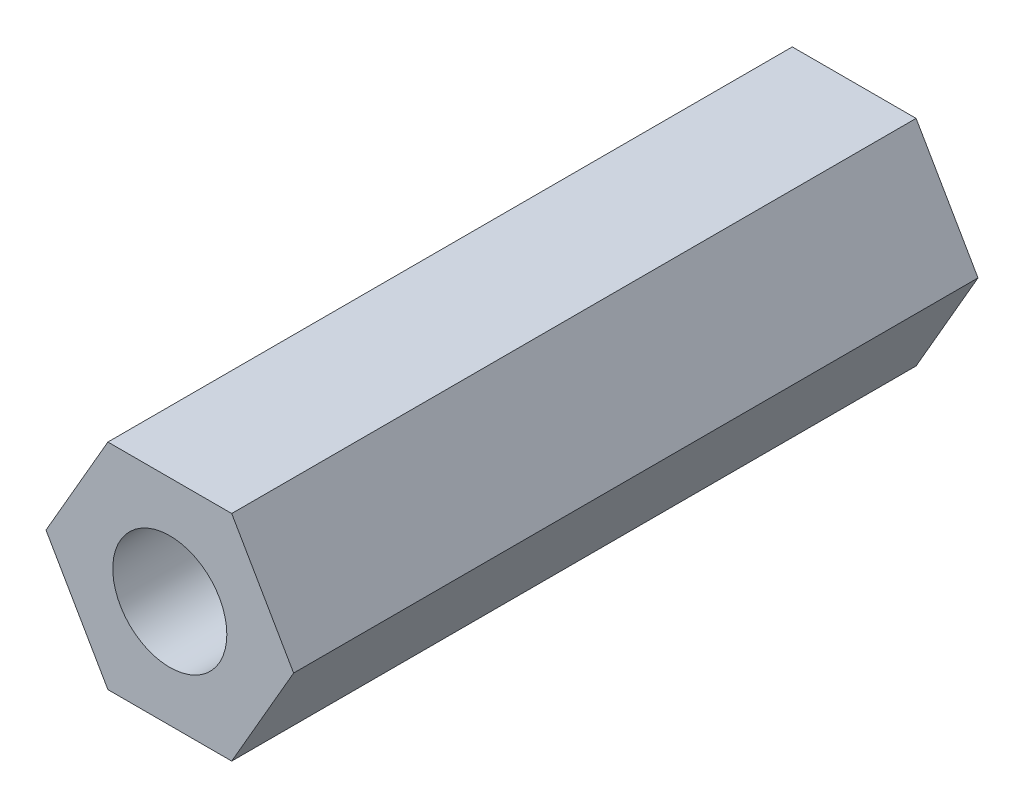
ISO-10303-21;
HEADER;
FILE_DESCRIPTION(('STEP AP214'),'2;1');
FILE_NAME('part.step','',(''),(''),'','','');
FILE_SCHEMA(('AUTOMOTIVE_DESIGN { 1 0 10303 214 1 1 1 1 }'));
ENDSEC;
DATA;
#1=APPLICATION_CONTEXT('core data for automotive mechanical design processes');
#2=APPLICATION_PROTOCOL_DEFINITION('international standard','automotive_design',2000,#1);
#3=PRODUCT_CONTEXT('',#1,'mechanical');
#4=PRODUCT('Part','Part','',(#3));
#5=PRODUCT_RELATED_PRODUCT_CATEGORY('part','',(#4));
#6=PRODUCT_DEFINITION_FORMATION('','',#4);
#7=PRODUCT_DEFINITION_CONTEXT('part definition',#1,'design');
#8=PRODUCT_DEFINITION('design','',#6,#7);
#9=PRODUCT_DEFINITION_SHAPE('','',#8);
#10=(LENGTH_UNIT() NAMED_UNIT(*) SI_UNIT(.MILLI.,.METRE.));
#11=(NAMED_UNIT(*) PLANE_ANGLE_UNIT() SI_UNIT($,.RADIAN.));
#12=(NAMED_UNIT(*) SI_UNIT($,.STERADIAN.) SOLID_ANGLE_UNIT());
#13=UNCERTAINTY_MEASURE_WITH_UNIT(LENGTH_MEASURE(1.E-05),#10,'distance_accuracy_value','');
#14=(GEOMETRIC_REPRESENTATION_CONTEXT(3) GLOBAL_UNCERTAINTY_ASSIGNED_CONTEXT((#13)) GLOBAL_UNIT_ASSIGNED_CONTEXT((#10,
#11,#12)) REPRESENTATION_CONTEXT('',''));
#15=CARTESIAN_POINT('',(0.,0.,0.));
#16=DIRECTION('',(0.,0.,1.));
#17=DIRECTION('',(1.,0.,0.));
#18=AXIS2_PLACEMENT_3D('',#15,#16,#17);
#19=CARTESIAN_POINT('',(2.71354626519124,0.,7.5));
#20=DIRECTION('',(-0.866025403784438,-0.5,0.));
#21=DIRECTION('',(0.5,-0.866025403784439,0.));
#22=AXIS2_PLACEMENT_3D('',#19,#20,#21);
#23=PLANE('',#22);
#24=DIRECTION('',(-0.5,0.866025403784438,0.));
#25=VECTOR('',#24,1.);
#26=CARTESIAN_POINT('',(2.71354626519124,0.,-7.5));
#27=LINE('',#26,#25);
#28=CARTESIAN_POINT('',(2.71354626519124,0.,-7.5));
#29=VERTEX_POINT('',#28);
#30=CARTESIAN_POINT('',(1.35677313259562,2.35,-7.5));
#31=VERTEX_POINT('',#30);
#32=EDGE_CURVE('E125',#29,#31,#27,.T.);
#33=ORIENTED_EDGE('',*,*,#32,.T.);
#34=DIRECTION('',(0.,0.,-1.));
#35=VECTOR('',#34,1.);
#36=CARTESIAN_POINT('',(1.35677313259562,2.35,7.5));
#37=LINE('',#36,#35);
#38=CARTESIAN_POINT('',(1.35677313259562,2.35,7.5));
#39=VERTEX_POINT('',#38);
#40=EDGE_CURVE('E11',#39,#31,#37,.T.);
#41=ORIENTED_EDGE('',*,*,#40,.F.);
#42=DIRECTION('',(-0.5,0.866025403784438,0.));
#43=VECTOR('',#42,1.);
#44=CARTESIAN_POINT('',(2.71354626519124,0.,7.5));
#45=LINE('',#44,#43);
#46=CARTESIAN_POINT('',(2.71354626519124,0.,7.5));
#47=VERTEX_POINT('',#46);
#48=EDGE_CURVE('E136',#47,#39,#45,.T.);
#49=ORIENTED_EDGE('',*,*,#48,.F.);
#50=DIRECTION('',(0.,0.,-1.));
#51=VECTOR('',#50,1.);
#52=CARTESIAN_POINT('',(2.71354626519124,0.,7.5));
#53=LINE('',#52,#51);
#54=EDGE_CURVE('E121',#47,#29,#53,.T.);
#55=ORIENTED_EDGE('',*,*,#54,.T.);
#56=EDGE_LOOP('',(#33,#41,#49,#55));
#57=FACE_BOUND('',#56,.T.);
#58=ADVANCED_FACE('F41',(#57),#23,.F.);
#59=CARTESIAN_POINT('',(1.35677313259562,2.35,7.5));
#60=DIRECTION('',(0.,-1.,0.));
#61=DIRECTION('',(0.,0.,-1.));
#62=AXIS2_PLACEMENT_3D('',#59,#60,#61);
#63=PLANE('',#62);
#64=DIRECTION('',(-1.,0.,0.));
#65=VECTOR('',#64,1.);
#66=CARTESIAN_POINT('',(1.35677313259562,2.35,-7.5));
#67=LINE('',#66,#65);
#68=CARTESIAN_POINT('',(-1.35677313259562,2.35,-7.5));
#69=VERTEX_POINT('',#68);
#70=EDGE_CURVE('E128',#31,#69,#67,.T.);
#71=ORIENTED_EDGE('',*,*,#70,.T.);
#72=DIRECTION('',(0.,0.,-1.));
#73=VECTOR('',#72,1.);
#74=CARTESIAN_POINT('',(-1.35677313259562,2.35,7.5));
#75=LINE('',#74,#73);
#76=CARTESIAN_POINT('',(-1.35677313259562,2.35,7.5));
#77=VERTEX_POINT('',#76);
#78=EDGE_CURVE('E49',#77,#69,#75,.T.);
#79=ORIENTED_EDGE('',*,*,#78,.F.);
#80=DIRECTION('',(-1.,0.,0.));
#81=VECTOR('',#80,1.);
#82=CARTESIAN_POINT('',(1.35677313259562,2.35,7.5));
#83=LINE('',#82,#81);
#84=EDGE_CURVE('E94',#39,#77,#83,.T.);
#85=ORIENTED_EDGE('',*,*,#84,.F.);
#86=ORIENTED_EDGE('',*,*,#40,.T.);
#87=EDGE_LOOP('',(#71,#79,#85,#86));
#88=FACE_BOUND('',#87,.T.);
#89=ADVANCED_FACE('F161',(#88),#63,.F.);
#90=CARTESIAN_POINT('',(-1.35677313259562,2.35,7.5));
#91=DIRECTION('',(0.866025403784439,-0.5,0.));
#92=DIRECTION('',(0.5,0.866025403784439,0.));
#93=AXIS2_PLACEMENT_3D('',#90,#91,#92);
#94=PLANE('',#93);
#95=DIRECTION('',(-0.5,-0.866025403784439,0.));
#96=VECTOR('',#95,1.);
#97=CARTESIAN_POINT('',(-1.35677313259562,2.35,-7.5));
#98=LINE('',#97,#96);
#99=CARTESIAN_POINT('',(-2.71354626519124,0.,-7.5));
#100=VERTEX_POINT('',#99);
#101=EDGE_CURVE('E131',#69,#100,#98,.T.);
#102=ORIENTED_EDGE('',*,*,#101,.T.);
#103=DIRECTION('',(0.,0.,-1.));
#104=VECTOR('',#103,1.);
#105=CARTESIAN_POINT('',(-2.71354626519124,0.,7.5));
#106=LINE('',#105,#104);
#107=CARTESIAN_POINT('',(-2.71354626519124,0.,7.5));
#108=VERTEX_POINT('',#107);
#109=EDGE_CURVE('E116',#108,#100,#106,.T.);
#110=ORIENTED_EDGE('',*,*,#109,.F.);
#111=DIRECTION('',(-0.5,-0.866025403784439,0.));
#112=VECTOR('',#111,1.);
#113=CARTESIAN_POINT('',(-1.35677313259562,2.35,7.5));
#114=LINE('',#113,#112);
#115=EDGE_CURVE('E107',#77,#108,#114,.T.);
#116=ORIENTED_EDGE('',*,*,#115,.F.);
#117=ORIENTED_EDGE('',*,*,#78,.T.);
#118=EDGE_LOOP('',(#102,#110,#116,#117));
#119=FACE_BOUND('',#118,.T.);
#120=ADVANCED_FACE('F142',(#119),#94,.F.);
#121=CARTESIAN_POINT('',(-2.71354626519124,0.,7.5));
#122=DIRECTION('',(0.866025403784439,0.5,0.));
#123=DIRECTION('',(-0.5,0.866025403784439,0.));
#124=AXIS2_PLACEMENT_3D('',#121,#122,#123);
#125=PLANE('',#124);
#126=DIRECTION('',(0.5,-0.866025403784439,0.));
#127=VECTOR('',#126,1.);
#128=CARTESIAN_POINT('',(-2.71354626519124,0.,-7.5));
#129=LINE('',#128,#127);
#130=CARTESIAN_POINT('',(-1.35677313259562,-2.35,-7.5));
#131=VERTEX_POINT('',#130);
#132=EDGE_CURVE('E115',#100,#131,#129,.T.);
#133=ORIENTED_EDGE('',*,*,#132,.T.);
#134=DIRECTION('',(0.,0.,-1.));
#135=VECTOR('',#134,1.);
#136=CARTESIAN_POINT('',(-1.35677313259562,-2.35,7.5));
#137=LINE('',#136,#135);
#138=CARTESIAN_POINT('',(-1.35677313259562,-2.35,7.5));
#139=VERTEX_POINT('',#138);
#140=EDGE_CURVE('E112',#139,#131,#137,.T.);
#141=ORIENTED_EDGE('',*,*,#140,.F.);
#142=DIRECTION('',(0.5,-0.866025403784439,0.));
#143=VECTOR('',#142,1.);
#144=CARTESIAN_POINT('',(-2.71354626519124,0.,7.5));
#145=LINE('',#144,#143);
#146=EDGE_CURVE('E101',#108,#139,#145,.T.);
#147=ORIENTED_EDGE('',*,*,#146,.F.);
#148=ORIENTED_EDGE('',*,*,#109,.T.);
#149=EDGE_LOOP('',(#133,#141,#147,#148));
#150=FACE_BOUND('',#149,.T.);
#151=ADVANCED_FACE('F113',(#150),#125,.F.);
#152=CARTESIAN_POINT('',(-1.35677313259562,-2.35,7.5));
#153=DIRECTION('',(0.,1.,0.));
#154=DIRECTION('',(0.,0.,1.));
#155=AXIS2_PLACEMENT_3D('',#152,#153,#154);
#156=PLANE('',#155);
#157=DIRECTION('',(1.,0.,0.));
#158=VECTOR('',#157,1.);
#159=CARTESIAN_POINT('',(-1.35677313259562,-2.35,-7.5));
#160=LINE('',#159,#158);
#161=CARTESIAN_POINT('',(1.35677313259562,-2.35,-7.5));
#162=VERTEX_POINT('',#161);
#163=EDGE_CURVE('E80',#131,#162,#160,.T.);
#164=ORIENTED_EDGE('',*,*,#163,.T.);
#165=DIRECTION('',(0.,0.,-1.));
#166=VECTOR('',#165,1.);
#167=CARTESIAN_POINT('',(1.35677313259562,-2.35,7.5));
#168=LINE('',#167,#166);
#169=CARTESIAN_POINT('',(1.35677313259562,-2.35,7.5));
#170=VERTEX_POINT('',#169);
#171=EDGE_CURVE('E117',#170,#162,#168,.T.);
#172=ORIENTED_EDGE('',*,*,#171,.F.);
#173=DIRECTION('',(1.,0.,0.));
#174=VECTOR('',#173,1.);
#175=CARTESIAN_POINT('',(-1.35677313259562,-2.35,7.5));
#176=LINE('',#175,#174);
#177=EDGE_CURVE('E105',#139,#170,#176,.T.);
#178=ORIENTED_EDGE('',*,*,#177,.F.);
#179=ORIENTED_EDGE('',*,*,#140,.T.);
#180=EDGE_LOOP('',(#164,#172,#178,#179));
#181=FACE_BOUND('',#180,.T.);
#182=ADVANCED_FACE('F119',(#181),#156,.F.);
#183=CARTESIAN_POINT('',(1.35677313259562,-2.35,7.5));
#184=DIRECTION('',(-0.866025403784439,0.5,0.));
#185=DIRECTION('',(-0.5,-0.866025403784439,0.));
#186=AXIS2_PLACEMENT_3D('',#183,#184,#185);
#187=PLANE('',#186);
#188=DIRECTION('',(0.5,0.866025403784439,0.));
#189=VECTOR('',#188,1.);
#190=CARTESIAN_POINT('',(1.35677313259562,-2.35,-7.5));
#191=LINE('',#190,#189);
#192=EDGE_CURVE('E86',#162,#29,#191,.T.);
#193=ORIENTED_EDGE('',*,*,#192,.T.);
#194=ORIENTED_EDGE('',*,*,#54,.F.);
#195=DIRECTION('',(0.5,0.866025403784439,0.));
#196=VECTOR('',#195,1.);
#197=CARTESIAN_POINT('',(1.35677313259562,-2.35,7.5));
#198=LINE('',#197,#196);
#199=EDGE_CURVE('E57',#170,#47,#198,.T.);
#200=ORIENTED_EDGE('',*,*,#199,.F.);
#201=ORIENTED_EDGE('',*,*,#171,.T.);
#202=EDGE_LOOP('',(#193,#194,#200,#201));
#203=FACE_BOUND('',#202,.T.);
#204=ADVANCED_FACE('F149',(#203),#187,.F.);
#205=CARTESIAN_POINT('',(0.,0.,7.5));
#206=DIRECTION('',(0.,0.,1.));
#207=DIRECTION('',(1.,0.,0.));
#208=AXIS2_PLACEMENT_3D('',#205,#206,#207);
#209=PLANE('',#208);
#210=CARTESIAN_POINT('',(0.,0.,7.5));
#211=DIRECTION('',(0.,0.,1.));
#212=DIRECTION('',(1.,0.,0.));
#213=AXIS2_PLACEMENT_3D('',#210,#211,#212);
#214=CIRCLE('',#213,1.25);
#215=CARTESIAN_POINT('',(1.25,0.,7.5));
#216=VERTEX_POINT('',#215);
#217=EDGE_CURVE('E129',#216,#216,#214,.T.);
#218=ORIENTED_EDGE('',*,*,#217,.F.);
#219=EDGE_LOOP('',(#218));
#220=FACE_BOUND('',#219,.T.);
#221=ORIENTED_EDGE('',*,*,#48,.T.);
#222=ORIENTED_EDGE('',*,*,#84,.T.);
#223=ORIENTED_EDGE('',*,*,#115,.T.);
#224=ORIENTED_EDGE('',*,*,#146,.T.);
#225=ORIENTED_EDGE('',*,*,#177,.T.);
#226=ORIENTED_EDGE('',*,*,#199,.T.);
#227=EDGE_LOOP('',(#221,#222,#223,#224,#225,#226));
#228=FACE_BOUND('',#227,.T.);
#229=ADVANCED_FACE('F103',(#220,#228),#209,.T.);
#230=CARTESIAN_POINT('',(0.,0.,-7.5));
#231=DIRECTION('',(0.,0.,1.));
#232=DIRECTION('',(1.,0.,0.));
#233=AXIS2_PLACEMENT_3D('',#230,#231,#232);
#234=PLANE('',#233);
#235=CARTESIAN_POINT('',(0.,0.,-7.5));
#236=DIRECTION('',(0.,0.,-1.));
#237=DIRECTION('',(-1.,0.,0.));
#238=AXIS2_PLACEMENT_3D('',#235,#236,#237);
#239=CIRCLE('',#238,1.25);
#240=CARTESIAN_POINT('',(-1.25,0.,-7.5));
#241=VERTEX_POINT('',#240);
#242=EDGE_CURVE('E237',#241,#241,#239,.T.);
#243=ORIENTED_EDGE('',*,*,#242,.F.);
#244=EDGE_LOOP('',(#243));
#245=FACE_BOUND('',#244,.T.);
#246=ORIENTED_EDGE('',*,*,#32,.F.);
#247=ORIENTED_EDGE('',*,*,#192,.F.);
#248=ORIENTED_EDGE('',*,*,#163,.F.);
#249=ORIENTED_EDGE('',*,*,#132,.F.);
#250=ORIENTED_EDGE('',*,*,#101,.F.);
#251=ORIENTED_EDGE('',*,*,#70,.F.);
#252=EDGE_LOOP('',(#246,#247,#248,#249,#250,#251));
#253=FACE_BOUND('',#252,.T.);
#254=ADVANCED_FACE('F145',(#245,#253),#234,.F.);
#255=CARTESIAN_POINT('',(0.,0.,7.5));
#256=DIRECTION('',(0.,0.,1.));
#257=DIRECTION('',(1.,0.,0.));
#258=AXIS2_PLACEMENT_3D('',#255,#256,#257);
#259=CYLINDRICAL_SURFACE('',#258,1.25);
#260=ORIENTED_EDGE('',*,*,#217,.T.);
#261=EDGE_LOOP('',(#260));
#262=FACE_BOUND('',#261,.T.);
#263=ORIENTED_EDGE('',*,*,#242,.T.);
#264=EDGE_LOOP('',(#263));
#265=FACE_BOUND('',#264,.T.);
#266=ADVANCED_FACE('F202',(#262,#265),#259,.F.);
#267=CLOSED_SHELL('',(#58,#89,#120,#151,#182,#204,#229,#254,#266));
#268=MANIFOLD_SOLID_BREP('B2',#267);
#269=ADVANCED_BREP_SHAPE_REPRESENTATION('',(#18,#268),#14);
#270=SHAPE_DEFINITION_REPRESENTATION(#9,#269);
ENDSEC;
END-ISO-10303-21;
